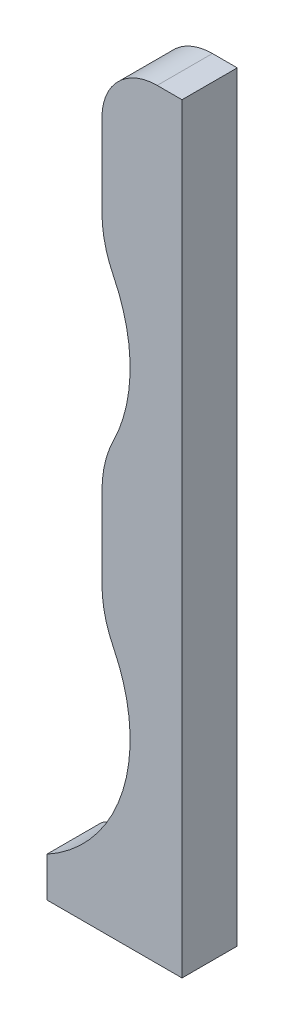
ISO-10303-21;
HEADER;
FILE_DESCRIPTION(('STEP AP214'),'2;1');
FILE_NAME('part.step','',(''),(''),'','','');
FILE_SCHEMA(('AUTOMOTIVE_DESIGN { 1 0 10303 214 1 1 1 1 }'));
ENDSEC;
DATA;
#1=APPLICATION_CONTEXT('core data for automotive mechanical design processes');
#2=APPLICATION_PROTOCOL_DEFINITION('international standard','automotive_design',2000,#1);
#3=PRODUCT_CONTEXT('',#1,'mechanical');
#4=PRODUCT('Part','Part','',(#3));
#5=PRODUCT_RELATED_PRODUCT_CATEGORY('part','',(#4));
#6=PRODUCT_DEFINITION_FORMATION('','',#4);
#7=PRODUCT_DEFINITION_CONTEXT('part definition',#1,'design');
#8=PRODUCT_DEFINITION('design','',#6,#7);
#9=PRODUCT_DEFINITION_SHAPE('','',#8);
#10=(LENGTH_UNIT() NAMED_UNIT(*) SI_UNIT(.MILLI.,.METRE.));
#11=(NAMED_UNIT(*) PLANE_ANGLE_UNIT() SI_UNIT($,.RADIAN.));
#12=(NAMED_UNIT(*) SI_UNIT($,.STERADIAN.) SOLID_ANGLE_UNIT());
#13=UNCERTAINTY_MEASURE_WITH_UNIT(LENGTH_MEASURE(1.E-05),#10,'distance_accuracy_value','');
#14=(GEOMETRIC_REPRESENTATION_CONTEXT(3) GLOBAL_UNCERTAINTY_ASSIGNED_CONTEXT((#13)) GLOBAL_UNIT_ASSIGNED_CONTEXT((#10,
#11,#12)) REPRESENTATION_CONTEXT('',''));
#15=CARTESIAN_POINT('',(0.,0.,0.));
#16=DIRECTION('',(0.,0.,1.));
#17=DIRECTION('',(1.,0.,0.));
#18=AXIS2_PLACEMENT_3D('',#15,#16,#17);
#19=CARTESIAN_POINT('',(3157.97875253879,2654.21176362941,3.175));
#20=DIRECTION('',(0.,0.,-1.));
#21=DIRECTION('',(-1.,0.,0.));
#22=AXIS2_PLACEMENT_3D('',#19,#20,#21);
#23=CYLINDRICAL_SURFACE('',#22,9.25195000000001);
#24=CARTESIAN_POINT('',(3157.97875253879,2654.21176362941,0.));
#25=DIRECTION('',(0.,0.,-1.));
#26=DIRECTION('',(1.,0.,0.));
#27=AXIS2_PLACEMENT_3D('',#24,#25,#26);
#28=CIRCLE('',#27,9.25195000000001);
#29=CARTESIAN_POINT('',(3166.27137704356,2658.31431864131,0.));
#30=VERTEX_POINT('',#29);
#31=CARTESIAN_POINT('',(3162.43795185812,2646.10533900243,0.));
#32=VERTEX_POINT('',#31);
#33=EDGE_CURVE('E153',#30,#32,#28,.T.);
#34=ORIENTED_EDGE('',*,*,#33,.T.);
#35=DIRECTION('',(0.,0.,-1.));
#36=VECTOR('',#35,1.);
#37=CARTESIAN_POINT('',(3162.43795185812,2646.10533900243,3.175));
#38=LINE('',#37,#36);
#39=CARTESIAN_POINT('',(3162.43795185812,2646.10533900243,3.175));
#40=VERTEX_POINT('',#39);
#41=EDGE_CURVE('E11',#40,#32,#38,.T.);
#42=ORIENTED_EDGE('',*,*,#41,.F.);
#43=CARTESIAN_POINT('',(3157.97875253879,2654.21176362941,3.175));
#44=DIRECTION('',(0.,0.,-1.));
#45=DIRECTION('',(1.,0.,0.));
#46=AXIS2_PLACEMENT_3D('',#43,#44,#45);
#47=CIRCLE('',#46,9.25195000000001);
#48=CARTESIAN_POINT('',(3166.27137704356,2658.31431864131,3.175));
#49=VERTEX_POINT('',#48);
#50=EDGE_CURVE('E175',#49,#40,#47,.T.);
#51=ORIENTED_EDGE('',*,*,#50,.F.);
#52=DIRECTION('',(0.,0.,-1.));
#53=VECTOR('',#52,1.);
#54=CARTESIAN_POINT('',(3166.27137704356,2658.31431864131,3.175));
#55=LINE('',#54,#53);
#56=EDGE_CURVE('E149',#49,#30,#55,.T.);
#57=ORIENTED_EDGE('',*,*,#56,.T.);
#58=EDGE_LOOP('',(#34,#42,#51,#57));
#59=FACE_BOUND('',#58,.T.);
#60=ADVANCED_FACE('F33',(#59),#23,.F.);
#61=CARTESIAN_POINT('',(3162.4379518581,2643.83191618663,3.175));
#62=DIRECTION('',(1.,-1.0157652484033E-11,0.));
#63=DIRECTION('',(1.0157652484033E-11,1.,0.));
#64=AXIS2_PLACEMENT_3D('',#61,#62,#63);
#65=PLANE('',#64);
#66=DIRECTION('',(-1.0157652484033E-11,-1.,0.));
#67=VECTOR('',#66,1.);
#68=CARTESIAN_POINT('',(3162.4379518581,2643.83191618663,0.));
#69=LINE('',#68,#67);
#70=CARTESIAN_POINT('',(3162.4379518581,2643.83191618663,0.));
#71=VERTEX_POINT('',#70);
#72=EDGE_CURVE('E156',#32,#71,#69,.T.);
#73=ORIENTED_EDGE('',*,*,#72,.T.);
#74=DIRECTION('',(0.,0.,-1.));
#75=VECTOR('',#74,1.);
#76=CARTESIAN_POINT('',(3162.4379518581,2643.83191618663,3.175));
#77=LINE('',#76,#75);
#78=CARTESIAN_POINT('',(3162.4379518581,2643.83191618663,3.175));
#79=VERTEX_POINT('',#78);
#80=EDGE_CURVE('E41',#79,#71,#77,.T.);
#81=ORIENTED_EDGE('',*,*,#80,.F.);
#82=DIRECTION('',(-1.0157652484033E-11,-1.,0.));
#83=VECTOR('',#82,1.);
#84=CARTESIAN_POINT('',(3162.4379518581,2643.83191618663,3.175));
#85=LINE('',#84,#83);
#86=EDGE_CURVE('E104',#40,#79,#85,.T.);
#87=ORIENTED_EDGE('',*,*,#86,.F.);
#88=ORIENTED_EDGE('',*,*,#41,.T.);
#89=EDGE_LOOP('',(#73,#81,#87,#88));
#90=FACE_BOUND('',#89,.T.);
#91=ADVANCED_FACE('F253',(#90),#65,.F.);
#92=CARTESIAN_POINT('',(3170.21520253879,2643.83191618663,3.175));
#93=DIRECTION('',(0.,1.,0.));
#94=DIRECTION('',(0.,0.,1.));
#95=AXIS2_PLACEMENT_3D('',#92,#93,#94);
#96=PLANE('',#95);
#97=DIRECTION('',(1.,0.,0.));
#98=VECTOR('',#97,1.);
#99=CARTESIAN_POINT('',(3170.21520253879,2643.83191618663,0.));
#100=LINE('',#99,#98);
#101=CARTESIAN_POINT('',(3170.21520253879,2643.83191618663,0.));
#102=VERTEX_POINT('',#101);
#103=EDGE_CURVE('E158',#71,#102,#100,.T.);
#104=ORIENTED_EDGE('',*,*,#103,.T.);
#105=DIRECTION('',(0.,0.,-1.));
#106=VECTOR('',#105,1.);
#107=CARTESIAN_POINT('',(3170.21520253879,2643.83191618663,3.175));
#108=LINE('',#107,#106);
#109=CARTESIAN_POINT('',(3170.21520253879,2643.83191618663,3.175));
#110=VERTEX_POINT('',#109);
#111=EDGE_CURVE('E194',#110,#102,#108,.T.);
#112=ORIENTED_EDGE('',*,*,#111,.F.);
#113=DIRECTION('',(1.,0.,0.));
#114=VECTOR('',#113,1.);
#115=CARTESIAN_POINT('',(3170.21520253879,2643.83191618663,3.175));
#116=LINE('',#115,#114);
#117=EDGE_CURVE('E202',#79,#110,#116,.T.);
#118=ORIENTED_EDGE('',*,*,#117,.F.);
#119=ORIENTED_EDGE('',*,*,#80,.T.);
#120=EDGE_LOOP('',(#104,#112,#118,#119));
#121=FACE_BOUND('',#120,.T.);
#122=ADVANCED_FACE('F200',(#121),#96,.F.);
#123=CARTESIAN_POINT('',(3170.21520253879,2687.56117296822,3.175));
#124=DIRECTION('',(-1.,0.,0.));
#125=DIRECTION('',(0.,0.,1.));
#126=AXIS2_PLACEMENT_3D('',#123,#124,#125);
#127=PLANE('',#126);
#128=DIRECTION('',(0.,1.,0.));
#129=VECTOR('',#128,1.);
#130=CARTESIAN_POINT('',(3170.21520253879,2687.56117296822,0.));
#131=LINE('',#130,#129);
#132=CARTESIAN_POINT('',(3170.21520253879,2687.56117296822,0.));
#133=VERTEX_POINT('',#132);
#134=EDGE_CURVE('E160',#102,#133,#131,.T.);
#135=ORIENTED_EDGE('',*,*,#134,.T.);
#136=DIRECTION('',(0.,0.,-1.));
#137=VECTOR('',#136,1.);
#138=CARTESIAN_POINT('',(3170.21520253879,2687.56117296822,3.175));
#139=LINE('',#138,#137);
#140=CARTESIAN_POINT('',(3170.21520253879,2687.56117296822,3.175));
#141=VERTEX_POINT('',#140);
#142=EDGE_CURVE('E191',#141,#133,#139,.T.);
#143=ORIENTED_EDGE('',*,*,#142,.F.);
#144=DIRECTION('',(0.,1.,0.));
#145=VECTOR('',#144,1.);
#146=CARTESIAN_POINT('',(3170.21520253879,2687.56117296822,3.175));
#147=LINE('',#146,#145);
#148=EDGE_CURVE('E220',#110,#141,#147,.T.);
#149=ORIENTED_EDGE('',*,*,#148,.F.);
#150=ORIENTED_EDGE('',*,*,#111,.T.);
#151=EDGE_LOOP('',(#135,#143,#149,#150));
#152=FACE_BOUND('',#151,.T.);
#153=ADVANCED_FACE('F211',(#152),#127,.F.);
#154=CARTESIAN_POINT('',(3170.21520253879,2687.56117296822,3.175));
#155=DIRECTION('',(0.,-1.,0.));
#156=DIRECTION('',(0.,0.,-1.));
#157=AXIS2_PLACEMENT_3D('',#154,#155,#156);
#158=PLANE('',#157);
#159=DIRECTION('',(-1.,0.,0.));
#160=VECTOR('',#159,1.);
#161=CARTESIAN_POINT('',(3170.21520253879,2687.56117296822,0.));
#162=LINE('',#161,#160);
#163=CARTESIAN_POINT('',(3168.7879518581,2687.56117296822,0.));
#164=VERTEX_POINT('',#163);
#165=EDGE_CURVE('E162',#133,#164,#162,.T.);
#166=ORIENTED_EDGE('',*,*,#165,.T.);
#167=DIRECTION('',(0.,0.,-1.));
#168=VECTOR('',#167,1.);
#169=CARTESIAN_POINT('',(3168.7879518581,2687.56117296822,3.175));
#170=LINE('',#169,#168);
#171=CARTESIAN_POINT('',(3168.7879518581,2687.56117296822,3.175));
#172=VERTEX_POINT('',#171);
#173=EDGE_CURVE('E188',#172,#164,#170,.T.);
#174=ORIENTED_EDGE('',*,*,#173,.F.);
#175=DIRECTION('',(-1.,0.,0.));
#176=VECTOR('',#175,1.);
#177=CARTESIAN_POINT('',(3170.21520253879,2687.56117296822,3.175));
#178=LINE('',#177,#176);
#179=EDGE_CURVE('E217',#141,#172,#178,.T.);
#180=ORIENTED_EDGE('',*,*,#179,.F.);
#181=ORIENTED_EDGE('',*,*,#142,.T.);
#182=EDGE_LOOP('',(#166,#174,#180,#181));
#183=FACE_BOUND('',#182,.T.);
#184=ADVANCED_FACE('F215',(#183),#158,.F.);
#185=CARTESIAN_POINT('',(3168.7879518581,2684.38617296822,3.175));
#186=DIRECTION('',(0.,0.,-1.));
#187=DIRECTION('',(-1.,0.,0.));
#188=AXIS2_PLACEMENT_3D('',#185,#186,#187);
#189=CYLINDRICAL_SURFACE('',#188,3.17500000000015);
#190=CARTESIAN_POINT('',(3168.7879518581,2684.38617296822,0.));
#191=DIRECTION('',(0.,0.,1.));
#192=DIRECTION('',(1.,0.,0.));
#193=AXIS2_PLACEMENT_3D('',#190,#191,#192);
#194=CIRCLE('',#193,3.17500000000015);
#195=CARTESIAN_POINT('',(3165.6129518581,2684.38617296822,0.));
#196=VERTEX_POINT('',#195);
#197=EDGE_CURVE('E164',#164,#196,#194,.T.);
#198=ORIENTED_EDGE('',*,*,#197,.T.);
#199=DIRECTION('',(0.,0.,-1.));
#200=VECTOR('',#199,1.);
#201=CARTESIAN_POINT('',(3165.6129518581,2684.38617296822,3.175));
#202=LINE('',#201,#200);
#203=CARTESIAN_POINT('',(3165.6129518581,2684.38617296822,3.175));
#204=VERTEX_POINT('',#203);
#205=EDGE_CURVE('E185',#204,#196,#202,.T.);
#206=ORIENTED_EDGE('',*,*,#205,.F.);
#207=CARTESIAN_POINT('',(3168.7879518581,2684.38617296822,3.175));
#208=DIRECTION('',(0.,0.,1.));
#209=DIRECTION('',(1.,0.,0.));
#210=AXIS2_PLACEMENT_3D('',#207,#208,#209);
#211=CIRCLE('',#210,3.17500000000015);
#212=EDGE_CURVE('E219',#172,#204,#211,.T.);
#213=ORIENTED_EDGE('',*,*,#212,.F.);
#214=ORIENTED_EDGE('',*,*,#173,.T.);
#215=EDGE_LOOP('',(#198,#206,#213,#214));
#216=FACE_BOUND('',#215,.T.);
#217=ADVANCED_FACE('F266',(#216),#189,.T.);
#218=CARTESIAN_POINT('',(3165.6129518581,2679.63397362546,3.175));
#219=DIRECTION('',(1.,0.,0.));
#220=DIRECTION('',(0.,0.,-1.));
#221=AXIS2_PLACEMENT_3D('',#218,#219,#220);
#222=PLANE('',#221);
#223=DIRECTION('',(0.,-1.,0.));
#224=VECTOR('',#223,1.);
#225=CARTESIAN_POINT('',(3165.6129518581,2679.63397362546,0.));
#226=LINE('',#225,#224);
#227=CARTESIAN_POINT('',(3165.6129518581,2679.63397362546,0.));
#228=VERTEX_POINT('',#227);
#229=EDGE_CURVE('E166',#196,#228,#226,.T.);
#230=ORIENTED_EDGE('',*,*,#229,.T.);
#231=DIRECTION('',(0.,0.,-1.));
#232=VECTOR('',#231,1.);
#233=CARTESIAN_POINT('',(3165.6129518581,2679.63397362546,3.175));
#234=LINE('',#233,#232);
#235=CARTESIAN_POINT('',(3165.6129518581,2679.63397362546,3.175));
#236=VERTEX_POINT('',#235);
#237=EDGE_CURVE('E182',#236,#228,#234,.T.);
#238=ORIENTED_EDGE('',*,*,#237,.F.);
#239=DIRECTION('',(0.,-1.,0.));
#240=VECTOR('',#239,1.);
#241=CARTESIAN_POINT('',(3165.6129518581,2679.63397362546,3.175));
#242=LINE('',#241,#240);
#243=EDGE_CURVE('E222',#204,#236,#242,.T.);
#244=ORIENTED_EDGE('',*,*,#243,.F.);
#245=ORIENTED_EDGE('',*,*,#205,.T.);
#246=EDGE_LOOP('',(#230,#238,#244,#245));
#247=FACE_BOUND('',#246,.T.);
#248=ADVANCED_FACE('F269',(#247),#222,.F.);
#249=CARTESIAN_POINT('',(3171.9629518581,2679.63397362538,3.175));
#250=DIRECTION('',(0.,0.,-1.));
#251=DIRECTION('',(-1.,0.,0.));
#252=AXIS2_PLACEMENT_3D('',#249,#250,#251);
#253=CYLINDRICAL_SURFACE('',#252,6.35000000000027);
#254=CARTESIAN_POINT('',(3171.9629518581,2679.63397362538,0.));
#255=DIRECTION('',(0.,0.,1.));
#256=DIRECTION('',(1.,0.,0.));
#257=AXIS2_PLACEMENT_3D('',#254,#255,#256);
#258=CIRCLE('',#257,6.35000000000027);
#259=CARTESIAN_POINT('',(3166.27137704355,2676.8182186413,0.));
#260=VERTEX_POINT('',#259);
#261=EDGE_CURVE('E168',#228,#260,#258,.T.);
#262=ORIENTED_EDGE('',*,*,#261,.T.);
#263=DIRECTION('',(0.,0.,-1.));
#264=VECTOR('',#263,1.);
#265=CARTESIAN_POINT('',(3166.27137704355,2676.8182186413,3.175));
#266=LINE('',#265,#264);
#267=CARTESIAN_POINT('',(3166.27137704355,2676.8182186413,3.175));
#268=VERTEX_POINT('',#267);
#269=EDGE_CURVE('E179',#268,#260,#266,.T.);
#270=ORIENTED_EDGE('',*,*,#269,.F.);
#271=CARTESIAN_POINT('',(3171.9629518581,2679.63397362538,3.175));
#272=DIRECTION('',(0.,0.,1.));
#273=DIRECTION('',(1.,0.,0.));
#274=AXIS2_PLACEMENT_3D('',#271,#272,#273);
#275=CIRCLE('',#274,6.35000000000027);
#276=EDGE_CURVE('E228',#236,#268,#275,.T.);
#277=ORIENTED_EDGE('',*,*,#276,.F.);
#278=ORIENTED_EDGE('',*,*,#237,.T.);
#279=EDGE_LOOP('',(#262,#270,#277,#278));
#280=FACE_BOUND('',#279,.T.);
#281=ADVANCED_FACE('F234',(#280),#253,.T.);
#282=CARTESIAN_POINT('',(3157.97875253879,2672.71566362941,3.175));
#283=DIRECTION('',(0.,0.,-1.));
#284=DIRECTION('',(-1.,0.,0.));
#285=AXIS2_PLACEMENT_3D('',#282,#283,#284);
#286=CYLINDRICAL_SURFACE('',#285,9.25195000000082);
#287=CARTESIAN_POINT('',(3157.97875253879,2672.71566362941,0.));
#288=DIRECTION('',(0.,0.,-1.));
#289=DIRECTION('',(1.,0.,0.));
#290=AXIS2_PLACEMENT_3D('',#287,#288,#289);
#291=CIRCLE('',#290,9.25195000000082);
#292=CARTESIAN_POINT('',(3166.27137704355,2668.61310861752,0.));
#293=VERTEX_POINT('',#292);
#294=EDGE_CURVE('E170',#260,#293,#291,.T.);
#295=ORIENTED_EDGE('',*,*,#294,.T.);
#296=DIRECTION('',(0.,0.,-1.));
#297=VECTOR('',#296,1.);
#298=CARTESIAN_POINT('',(3166.27137704355,2668.61310861752,3.175));
#299=LINE('',#298,#297);
#300=CARTESIAN_POINT('',(3166.27137704355,2668.61310861752,3.175));
#301=VERTEX_POINT('',#300);
#302=EDGE_CURVE('E144',#301,#293,#299,.T.);
#303=ORIENTED_EDGE('',*,*,#302,.F.);
#304=CARTESIAN_POINT('',(3157.97875253879,2672.71566362941,3.175));
#305=DIRECTION('',(0.,0.,-1.));
#306=DIRECTION('',(1.,0.,0.));
#307=AXIS2_PLACEMENT_3D('',#304,#305,#306);
#308=CIRCLE('',#307,9.25195000000082);
#309=EDGE_CURVE('E135',#268,#301,#308,.T.);
#310=ORIENTED_EDGE('',*,*,#309,.F.);
#311=ORIENTED_EDGE('',*,*,#269,.T.);
#312=EDGE_LOOP('',(#295,#303,#310,#311));
#313=FACE_BOUND('',#312,.T.);
#314=ADVANCED_FACE('F238',(#313),#286,.F.);
#315=CARTESIAN_POINT('',(3171.9629518581,2665.79735363344,3.175));
#316=DIRECTION('',(0.,0.,-1.));
#317=DIRECTION('',(-1.,0.,0.));
#318=AXIS2_PLACEMENT_3D('',#315,#316,#317);
#319=CYLINDRICAL_SURFACE('',#318,6.35000000000017);
#320=CARTESIAN_POINT('',(3171.9629518581,2665.79735363344,0.));
#321=DIRECTION('',(0.,0.,1.));
#322=DIRECTION('',(1.,0.,0.));
#323=AXIS2_PLACEMENT_3D('',#320,#321,#322);
#324=CIRCLE('',#323,6.35000000000017);
#325=CARTESIAN_POINT('',(3165.6129518581,2665.79735363337,0.));
#326=VERTEX_POINT('',#325);
#327=EDGE_CURVE('E143',#293,#326,#324,.T.);
#328=ORIENTED_EDGE('',*,*,#327,.T.);
#329=DIRECTION('',(0.,0.,-1.));
#330=VECTOR('',#329,1.);
#331=CARTESIAN_POINT('',(3165.6129518581,2665.79735363337,3.175));
#332=LINE('',#331,#330);
#333=CARTESIAN_POINT('',(3165.6129518581,2665.79735363337,3.175));
#334=VERTEX_POINT('',#333);
#335=EDGE_CURVE('E140',#334,#326,#332,.T.);
#336=ORIENTED_EDGE('',*,*,#335,.F.);
#337=CARTESIAN_POINT('',(3171.9629518581,2665.79735363344,3.175));
#338=DIRECTION('',(0.,0.,1.));
#339=DIRECTION('',(1.,0.,0.));
#340=AXIS2_PLACEMENT_3D('',#337,#338,#339);
#341=CIRCLE('',#340,6.35000000000017);
#342=EDGE_CURVE('E129',#301,#334,#341,.T.);
#343=ORIENTED_EDGE('',*,*,#342,.F.);
#344=ORIENTED_EDGE('',*,*,#302,.T.);
#345=EDGE_LOOP('',(#328,#336,#343,#344));
#346=FACE_BOUND('',#345,.T.);
#347=ADVANCED_FACE('F141',(#346),#319,.T.);
#348=CARTESIAN_POINT('',(3165.6129518581,2661.13007362546,3.175));
#349=DIRECTION('',(1.,0.,0.));
#350=DIRECTION('',(0.,1.,0.));
#351=AXIS2_PLACEMENT_3D('',#348,#349,#350);
#352=PLANE('',#351);
#353=DIRECTION('',(0.,-1.,0.));
#354=VECTOR('',#353,1.);
#355=CARTESIAN_POINT('',(3165.6129518581,2661.13007362546,0.));
#356=LINE('',#355,#354);
#357=CARTESIAN_POINT('',(3165.6129518581,2661.13007362546,0.));
#358=VERTEX_POINT('',#357);
#359=EDGE_CURVE('E90',#326,#358,#356,.T.);
#360=ORIENTED_EDGE('',*,*,#359,.T.);
#361=DIRECTION('',(0.,0.,-1.));
#362=VECTOR('',#361,1.);
#363=CARTESIAN_POINT('',(3165.6129518581,2661.13007362546,3.175));
#364=LINE('',#363,#362);
#365=CARTESIAN_POINT('',(3165.6129518581,2661.13007362546,3.175));
#366=VERTEX_POINT('',#365);
#367=EDGE_CURVE('E145',#366,#358,#364,.T.);
#368=ORIENTED_EDGE('',*,*,#367,.F.);
#369=DIRECTION('',(0.,-1.,0.));
#370=VECTOR('',#369,1.);
#371=CARTESIAN_POINT('',(3165.6129518581,2661.13007362546,3.175));
#372=LINE('',#371,#370);
#373=EDGE_CURVE('E133',#334,#366,#372,.T.);
#374=ORIENTED_EDGE('',*,*,#373,.F.);
#375=ORIENTED_EDGE('',*,*,#335,.T.);
#376=EDGE_LOOP('',(#360,#368,#374,#375));
#377=FACE_BOUND('',#376,.T.);
#378=ADVANCED_FACE('F147',(#377),#352,.F.);
#379=CARTESIAN_POINT('',(3171.9629518581,2661.13007362546,3.175));
#380=DIRECTION('',(0.,0.,-1.));
#381=DIRECTION('',(-1.,0.,0.));
#382=AXIS2_PLACEMENT_3D('',#379,#380,#381);
#383=CYLINDRICAL_SURFACE('',#382,6.35000000001681);
#384=CARTESIAN_POINT('',(3171.9629518581,2661.13007362546,0.));
#385=DIRECTION('',(0.,0.,1.));
#386=DIRECTION('',(1.,0.,0.));
#387=AXIS2_PLACEMENT_3D('',#384,#385,#386);
#388=CIRCLE('',#387,6.35000000001681);
#389=EDGE_CURVE('E96',#358,#30,#388,.T.);
#390=ORIENTED_EDGE('',*,*,#389,.T.);
#391=ORIENTED_EDGE('',*,*,#56,.F.);
#392=CARTESIAN_POINT('',(3171.9629518581,2661.13007362546,3.175));
#393=DIRECTION('',(0.,0.,1.));
#394=DIRECTION('',(1.,0.,0.));
#395=AXIS2_PLACEMENT_3D('',#392,#393,#394);
#396=CIRCLE('',#395,6.35000000001681);
#397=EDGE_CURVE('E49',#366,#49,#396,.T.);
#398=ORIENTED_EDGE('',*,*,#397,.F.);
#399=ORIENTED_EDGE('',*,*,#367,.T.);
#400=EDGE_LOOP('',(#390,#391,#398,#399));
#401=FACE_BOUND('',#400,.T.);
#402=ADVANCED_FACE('F242',(#401),#383,.T.);
#403=CARTESIAN_POINT('',(3157.97875253879,2654.21176362941,3.175));
#404=DIRECTION('',(0.,0.,1.));
#405=DIRECTION('',(1.,0.,0.));
#406=AXIS2_PLACEMENT_3D('',#403,#404,#405);
#407=PLANE('',#406);
#408=ORIENTED_EDGE('',*,*,#50,.T.);
#409=ORIENTED_EDGE('',*,*,#86,.T.);
#410=ORIENTED_EDGE('',*,*,#117,.T.);
#411=ORIENTED_EDGE('',*,*,#148,.T.);
#412=ORIENTED_EDGE('',*,*,#179,.T.);
#413=ORIENTED_EDGE('',*,*,#212,.T.);
#414=ORIENTED_EDGE('',*,*,#243,.T.);
#415=ORIENTED_EDGE('',*,*,#276,.T.);
#416=ORIENTED_EDGE('',*,*,#309,.T.);
#417=ORIENTED_EDGE('',*,*,#342,.T.);
#418=ORIENTED_EDGE('',*,*,#373,.T.);
#419=ORIENTED_EDGE('',*,*,#397,.T.);
#420=EDGE_LOOP('',(#408,#409,#410,#411,#412,#413,#414,#415,#416,#417,#418,#419));
#421=FACE_BOUND('',#420,.T.);
#422=ADVANCED_FACE('F131',(#421),#407,.T.);
#423=CARTESIAN_POINT('',(3157.97875253879,2654.21176362941,0.));
#424=DIRECTION('',(0.,0.,1.));
#425=DIRECTION('',(1.,0.,0.));
#426=AXIS2_PLACEMENT_3D('',#423,#424,#425);
#427=PLANE('',#426);
#428=ORIENTED_EDGE('',*,*,#33,.F.);
#429=ORIENTED_EDGE('',*,*,#389,.F.);
#430=ORIENTED_EDGE('',*,*,#359,.F.);
#431=ORIENTED_EDGE('',*,*,#327,.F.);
#432=ORIENTED_EDGE('',*,*,#294,.F.);
#433=ORIENTED_EDGE('',*,*,#261,.F.);
#434=ORIENTED_EDGE('',*,*,#229,.F.);
#435=ORIENTED_EDGE('',*,*,#197,.F.);
#436=ORIENTED_EDGE('',*,*,#165,.F.);
#437=ORIENTED_EDGE('',*,*,#134,.F.);
#438=ORIENTED_EDGE('',*,*,#103,.F.);
#439=ORIENTED_EDGE('',*,*,#72,.F.);
#440=EDGE_LOOP('',(#428,#429,#430,#431,#432,#433,#434,#435,#436,#437,#438,#439));
#441=FACE_BOUND('',#440,.T.);
#442=ADVANCED_FACE('F206',(#441),#427,.F.);
#443=CLOSED_SHELL('',(#60,#91,#122,#153,#184,#217,#248,#281,#314,#347,#378,#402,#422,#442));
#444=MANIFOLD_SOLID_BREP('B2',#443);
#445=ADVANCED_BREP_SHAPE_REPRESENTATION('',(#18,#444),#14);
#446=SHAPE_DEFINITION_REPRESENTATION(#9,#445);
ENDSEC;
END-ISO-10303-21;
